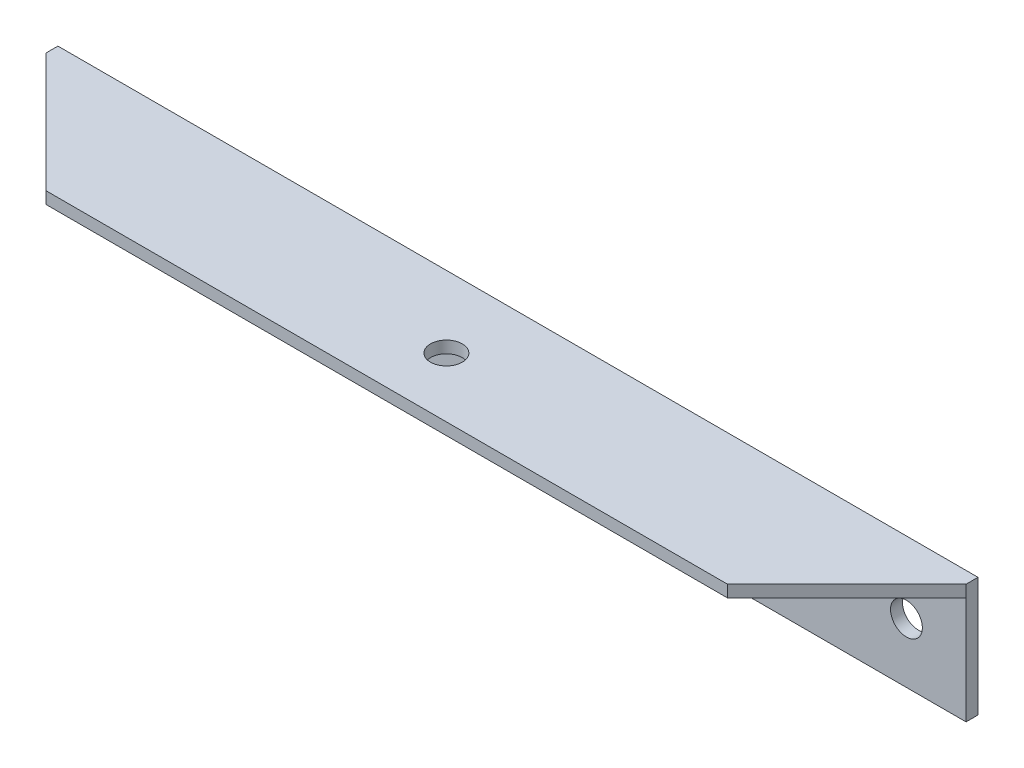
ISO-10303-21;
HEADER;
FILE_DESCRIPTION(('STEP AP214'),'2;1');
FILE_NAME('part.step','',(''),(''),'','','');
FILE_SCHEMA(('AUTOMOTIVE_DESIGN { 1 0 10303 214 1 1 1 1 }'));
ENDSEC;
DATA;
#1=APPLICATION_CONTEXT('core data for automotive mechanical design processes');
#2=APPLICATION_PROTOCOL_DEFINITION('international standard','automotive_design',2000,#1);
#3=PRODUCT_CONTEXT('',#1,'mechanical');
#4=PRODUCT('Part','Part','',(#3));
#5=PRODUCT_RELATED_PRODUCT_CATEGORY('part','',(#4));
#6=PRODUCT_DEFINITION_FORMATION('','',#4);
#7=PRODUCT_DEFINITION_CONTEXT('part definition',#1,'design');
#8=PRODUCT_DEFINITION('design','',#6,#7);
#9=PRODUCT_DEFINITION_SHAPE('','',#8);
#10=(LENGTH_UNIT() NAMED_UNIT(*) SI_UNIT(.MILLI.,.METRE.));
#11=(NAMED_UNIT(*) PLANE_ANGLE_UNIT() SI_UNIT($,.RADIAN.));
#12=(NAMED_UNIT(*) SI_UNIT($,.STERADIAN.) SOLID_ANGLE_UNIT());
#13=UNCERTAINTY_MEASURE_WITH_UNIT(LENGTH_MEASURE(1.E-05),#10,'distance_accuracy_value','');
#14=(GEOMETRIC_REPRESENTATION_CONTEXT(3) GLOBAL_UNCERTAINTY_ASSIGNED_CONTEXT((#13)) GLOBAL_UNIT_ASSIGNED_CONTEXT((#10,
#11,#12)) REPRESENTATION_CONTEXT('',''));
#15=CARTESIAN_POINT('',(0.,0.,0.));
#16=DIRECTION('',(0.,0.,1.));
#17=DIRECTION('',(1.,0.,0.));
#18=AXIS2_PLACEMENT_3D('',#15,#16,#17);
#19=CARTESIAN_POINT('',(-115.7,-30.,3.));
#20=DIRECTION('',(0.,1.,0.));
#21=DIRECTION('',(-1.,0.,0.));
#22=AXIS2_PLACEMENT_3D('',#19,#20,#21);
#23=PLANE('',#22);
#24=DIRECTION('',(1.,0.,0.));
#25=VECTOR('',#24,1.);
#26=CARTESIAN_POINT('',(-115.7,-30.,0.));
#27=LINE('',#26,#25);
#28=CARTESIAN_POINT('',(-115.7,-30.,0.));
#29=VERTEX_POINT('',#28);
#30=CARTESIAN_POINT('',(115.7,-30.,0.));
#31=VERTEX_POINT('',#30);
#32=EDGE_CURVE('E94',#29,#31,#27,.T.);
#33=ORIENTED_EDGE('',*,*,#32,.T.);
#34=DIRECTION('',(0.,0.,-1.));
#35=VECTOR('',#34,1.);
#36=CARTESIAN_POINT('',(115.7,-30.,3.));
#37=LINE('',#36,#35);
#38=CARTESIAN_POINT('',(115.7,-30.,3.));
#39=VERTEX_POINT('',#38);
#40=EDGE_CURVE('E11',#39,#31,#37,.T.);
#41=ORIENTED_EDGE('',*,*,#40,.F.);
#42=DIRECTION('',(1.,0.,0.));
#43=VECTOR('',#42,1.);
#44=CARTESIAN_POINT('',(-115.7,-30.,3.));
#45=LINE('',#44,#43);
#46=CARTESIAN_POINT('',(-115.7,-30.,3.));
#47=VERTEX_POINT('',#46);
#48=EDGE_CURVE('E88',#47,#39,#45,.T.);
#49=ORIENTED_EDGE('',*,*,#48,.F.);
#50=DIRECTION('',(0.,0.,-1.));
#51=VECTOR('',#50,1.);
#52=CARTESIAN_POINT('',(-115.7,-30.,3.));
#53=LINE('',#52,#51);
#54=EDGE_CURVE('E80',#47,#29,#53,.T.);
#55=ORIENTED_EDGE('',*,*,#54,.T.);
#56=EDGE_LOOP('',(#33,#41,#49,#55));
#57=FACE_BOUND('',#56,.T.);
#58=ADVANCED_FACE('F34',(#57),#23,.F.);
#59=CARTESIAN_POINT('',(115.7,0.,3.));
#60=DIRECTION('',(-1.,0.,0.));
#61=DIRECTION('',(0.,0.,1.));
#62=AXIS2_PLACEMENT_3D('',#59,#60,#61);
#63=PLANE('',#62);
#64=DIRECTION('',(0.,1.,0.));
#65=VECTOR('',#64,1.);
#66=CARTESIAN_POINT('',(115.7,0.,0.));
#67=LINE('',#66,#65);
#68=CARTESIAN_POINT('',(115.7,0.,0.));
#69=VERTEX_POINT('',#68);
#70=EDGE_CURVE('E98',#31,#69,#67,.T.);
#71=ORIENTED_EDGE('',*,*,#70,.T.);
#72=DIRECTION('',(0.,0.,-1.));
#73=VECTOR('',#72,1.);
#74=CARTESIAN_POINT('',(115.7,0.,3.));
#75=LINE('',#74,#73);
#76=CARTESIAN_POINT('',(115.7,0.,3.));
#77=VERTEX_POINT('',#76);
#78=EDGE_CURVE('E41',#77,#69,#75,.T.);
#79=ORIENTED_EDGE('',*,*,#78,.F.);
#80=DIRECTION('',(0.,1.,0.));
#81=VECTOR('',#80,1.);
#82=CARTESIAN_POINT('',(115.7,-3.,3.));
#83=LINE('',#82,#81);
#84=CARTESIAN_POINT('',(115.7,-3.,3.));
#85=VERTEX_POINT('',#84);
#86=EDGE_CURVE('E99',#85,#77,#83,.T.);
#87=ORIENTED_EDGE('',*,*,#86,.F.);
#88=DIRECTION('',(0.,1.,0.));
#89=VECTOR('',#88,1.);
#90=CARTESIAN_POINT('',(115.7,0.,3.));
#91=LINE('',#90,#89);
#92=EDGE_CURVE('E168',#39,#85,#91,.T.);
#93=ORIENTED_EDGE('',*,*,#92,.F.);
#94=ORIENTED_EDGE('',*,*,#40,.T.);
#95=EDGE_LOOP('',(#71,#79,#87,#93,#94));
#96=FACE_BOUND('',#95,.T.);
#97=ADVANCED_FACE('F120',(#96),#63,.F.);
#98=CARTESIAN_POINT('',(-115.7,0.,3.));
#99=DIRECTION('',(0.,-1.,0.));
#100=DIRECTION('',(0.,0.,-1.));
#101=AXIS2_PLACEMENT_3D('',#98,#99,#100);
#102=PLANE('',#101);
#103=CARTESIAN_POINT('',(0.,0.,18.));
#104=DIRECTION('',(0.,-1.,0.));
#105=DIRECTION('',(0.,0.,-1.));
#106=AXIS2_PLACEMENT_3D('',#103,#104,#105);
#107=CIRCLE('',#106,4.);
#108=CARTESIAN_POINT('',(0.,0.,14.));
#109=VERTEX_POINT('',#108);
#110=EDGE_CURVE('E199',#109,#109,#107,.T.);
#111=ORIENTED_EDGE('',*,*,#110,.T.);
#112=EDGE_LOOP('',(#111));
#113=FACE_BOUND('',#112,.T.);
#114=DIRECTION('',(-1.,0.,0.));
#115=VECTOR('',#114,1.);
#116=CARTESIAN_POINT('',(-115.7,0.,0.));
#117=LINE('',#116,#115);
#118=CARTESIAN_POINT('',(-115.7,0.,0.));
#119=VERTEX_POINT('',#118);
#120=EDGE_CURVE('E89',#69,#119,#117,.T.);
#121=ORIENTED_EDGE('',*,*,#120,.T.);
#122=DIRECTION('',(0.,0.,-1.));
#123=VECTOR('',#122,1.);
#124=CARTESIAN_POINT('',(-115.7,0.,3.));
#125=LINE('',#124,#123);
#126=CARTESIAN_POINT('',(-115.7,0.,3.));
#127=VERTEX_POINT('',#126);
#128=EDGE_CURVE('E84',#127,#119,#125,.T.);
#129=ORIENTED_EDGE('',*,*,#128,.F.);
#130=DIRECTION('',(0.707106781186546,0.,0.707106781186549));
#131=VECTOR('',#130,1.);
#132=CARTESIAN_POINT('',(-115.7,0.,3.));
#133=LINE('',#132,#131);
#134=CARTESIAN_POINT('',(-85.7000000000001,0.,33.));
#135=VERTEX_POINT('',#134);
#136=EDGE_CURVE('E164',#127,#135,#133,.T.);
#137=ORIENTED_EDGE('',*,*,#136,.T.);
#138=DIRECTION('',(1.,0.,0.));
#139=VECTOR('',#138,1.);
#140=CARTESIAN_POINT('',(-85.7000000000001,0.,33.));
#141=LINE('',#140,#139);
#142=CARTESIAN_POINT('',(85.6999999999997,0.,33.));
#143=VERTEX_POINT('',#142);
#144=EDGE_CURVE('E146',#135,#143,#141,.T.);
#145=ORIENTED_EDGE('',*,*,#144,.T.);
#146=DIRECTION('',(0.707106781186551,0.,-0.707106781186544));
#147=VECTOR('',#146,1.);
#148=CARTESIAN_POINT('',(115.7,0.,3.));
#149=LINE('',#148,#147);
#150=EDGE_CURVE('E117',#143,#77,#149,.T.);
#151=ORIENTED_EDGE('',*,*,#150,.T.);
#152=ORIENTED_EDGE('',*,*,#78,.T.);
#153=EDGE_LOOP('',(#121,#129,#137,#145,#151,#152));
#154=FACE_BOUND('',#153,.T.);
#155=ADVANCED_FACE('F113',(#113,#154),#102,.F.);
#156=CARTESIAN_POINT('',(-115.7,0.,3.));
#157=DIRECTION('',(1.,0.,0.));
#158=DIRECTION('',(0.,0.,-1.));
#159=AXIS2_PLACEMENT_3D('',#156,#157,#158);
#160=PLANE('',#159);
#161=DIRECTION('',(0.,-1.,0.));
#162=VECTOR('',#161,1.);
#163=CARTESIAN_POINT('',(-115.7,0.,0.));
#164=LINE('',#163,#162);
#165=EDGE_CURVE('E77',#119,#29,#164,.T.);
#166=ORIENTED_EDGE('',*,*,#165,.T.);
#167=ORIENTED_EDGE('',*,*,#54,.F.);
#168=DIRECTION('',(0.,-1.,0.));
#169=VECTOR('',#168,1.);
#170=CARTESIAN_POINT('',(-115.7,0.,3.));
#171=LINE('',#170,#169);
#172=CARTESIAN_POINT('',(-115.7,-3.,3.));
#173=VERTEX_POINT('',#172);
#174=EDGE_CURVE('E57',#173,#47,#171,.T.);
#175=ORIENTED_EDGE('',*,*,#174,.F.);
#176=EDGE_CURVE('E95',#127,#173,#171,.T.);
#177=ORIENTED_EDGE('',*,*,#176,.F.);
#178=ORIENTED_EDGE('',*,*,#128,.T.);
#179=EDGE_LOOP('',(#166,#167,#175,#177,#178));
#180=FACE_BOUND('',#179,.T.);
#181=ADVANCED_FACE('F79',(#180),#160,.F.);
#182=CARTESIAN_POINT('',(0.,0.,3.));
#183=DIRECTION('',(0.,0.,-1.));
#184=DIRECTION('',(-1.,0.,0.));
#185=AXIS2_PLACEMENT_3D('',#182,#183,#184);
#186=PLANE('',#185);
#187=CARTESIAN_POINT('',(-100.69999999989,-15.0000000002572,3.));
#188=DIRECTION('',(0.,0.,-1.));
#189=DIRECTION('',(-1.,0.,0.));
#190=AXIS2_PLACEMENT_3D('',#187,#188,#189);
#191=CIRCLE('',#190,4.);
#192=CARTESIAN_POINT('',(-104.69999999989,-15.0000000002572,3.));
#193=VERTEX_POINT('',#192);
#194=EDGE_CURVE('E205',#193,#193,#191,.T.);
#195=ORIENTED_EDGE('',*,*,#194,.T.);
#196=EDGE_LOOP('',(#195));
#197=FACE_BOUND('',#196,.T.);
#198=CARTESIAN_POINT('',(100.700000000335,-15.0000000002572,3.));
#199=DIRECTION('',(0.,0.,-1.));
#200=DIRECTION('',(-1.,0.,0.));
#201=AXIS2_PLACEMENT_3D('',#198,#199,#200);
#202=CIRCLE('',#201,3.99999999999999);
#203=CARTESIAN_POINT('',(96.7000000003347,-15.0000000002572,3.));
#204=VERTEX_POINT('',#203);
#205=EDGE_CURVE('E159',#204,#204,#202,.T.);
#206=ORIENTED_EDGE('',*,*,#205,.T.);
#207=EDGE_LOOP('',(#206));
#208=FACE_BOUND('',#207,.T.);
#209=ORIENTED_EDGE('',*,*,#92,.T.);
#210=DIRECTION('',(-1.,0.,0.));
#211=VECTOR('',#210,1.);
#212=CARTESIAN_POINT('',(-115.7,-3.,3.));
#213=LINE('',#212,#211);
#214=EDGE_CURVE('E149',#85,#173,#213,.T.);
#215=ORIENTED_EDGE('',*,*,#214,.T.);
#216=ORIENTED_EDGE('',*,*,#174,.T.);
#217=ORIENTED_EDGE('',*,*,#48,.T.);
#218=EDGE_LOOP('',(#209,#215,#216,#217));
#219=FACE_BOUND('',#218,.T.);
#220=ADVANCED_FACE('F169',(#197,#208,#219),#186,.F.);
#221=CARTESIAN_POINT('',(0.,0.,0.));
#222=DIRECTION('',(0.,0.,-1.));
#223=DIRECTION('',(-1.,0.,0.));
#224=AXIS2_PLACEMENT_3D('',#221,#222,#223);
#225=PLANE('',#224);
#226=CARTESIAN_POINT('',(-100.69999999989,-15.0000000002572,0.));
#227=DIRECTION('',(0.,0.,-1.));
#228=DIRECTION('',(-1.,0.,0.));
#229=AXIS2_PLACEMENT_3D('',#226,#227,#228);
#230=CIRCLE('',#229,4.);
#231=CARTESIAN_POINT('',(-104.69999999989,-15.0000000002572,0.));
#232=VERTEX_POINT('',#231);
#233=EDGE_CURVE('E201',#232,#232,#230,.T.);
#234=ORIENTED_EDGE('',*,*,#233,.F.);
#235=EDGE_LOOP('',(#234));
#236=FACE_BOUND('',#235,.T.);
#237=CARTESIAN_POINT('',(100.700000000335,-15.0000000002572,0.));
#238=DIRECTION('',(0.,0.,-1.));
#239=DIRECTION('',(-1.,0.,0.));
#240=AXIS2_PLACEMENT_3D('',#237,#238,#239);
#241=CIRCLE('',#240,3.99999999999999);
#242=CARTESIAN_POINT('',(96.7000000003347,-15.0000000002572,0.));
#243=VERTEX_POINT('',#242);
#244=EDGE_CURVE('E210',#243,#243,#241,.T.);
#245=ORIENTED_EDGE('',*,*,#244,.F.);
#246=EDGE_LOOP('',(#245));
#247=FACE_BOUND('',#246,.T.);
#248=ORIENTED_EDGE('',*,*,#32,.F.);
#249=ORIENTED_EDGE('',*,*,#165,.F.);
#250=ORIENTED_EDGE('',*,*,#120,.F.);
#251=ORIENTED_EDGE('',*,*,#70,.F.);
#252=EDGE_LOOP('',(#248,#249,#250,#251));
#253=FACE_BOUND('',#252,.T.);
#254=ADVANCED_FACE('F97',(#236,#247,#253),#225,.T.);
#255=CARTESIAN_POINT('',(-115.7,-3.,3.));
#256=DIRECTION('',(-0.707106781186549,0.,0.707106781186546));
#257=DIRECTION('',(0.707106781186546,0.,0.707106781186549));
#258=AXIS2_PLACEMENT_3D('',#255,#256,#257);
#259=PLANE('',#258);
#260=ORIENTED_EDGE('',*,*,#136,.F.);
#261=ORIENTED_EDGE('',*,*,#176,.T.);
#262=DIRECTION('',(0.707106781186546,0.,0.707106781186549));
#263=VECTOR('',#262,1.);
#264=CARTESIAN_POINT('',(-115.7,-3.,3.));
#265=LINE('',#264,#263);
#266=CARTESIAN_POINT('',(-85.7000000000001,-3.,33.));
#267=VERTEX_POINT('',#266);
#268=EDGE_CURVE('E48',#173,#267,#265,.T.);
#269=ORIENTED_EDGE('',*,*,#268,.T.);
#270=DIRECTION('',(0.,1.,0.));
#271=VECTOR('',#270,1.);
#272=CARTESIAN_POINT('',(-85.7000000000001,-3.,33.));
#273=LINE('',#272,#271);
#274=EDGE_CURVE('E143',#267,#135,#273,.T.);
#275=ORIENTED_EDGE('',*,*,#274,.T.);
#276=EDGE_LOOP('',(#260,#261,#269,#275));
#277=FACE_BOUND('',#276,.T.);
#278=ADVANCED_FACE('F155',(#277),#259,.T.);
#279=CARTESIAN_POINT('',(115.7,-3.,3.));
#280=DIRECTION('',(0.707106781186544,0.,0.707106781186551));
#281=DIRECTION('',(0.707106781186551,0.,-0.707106781186544));
#282=AXIS2_PLACEMENT_3D('',#279,#280,#281);
#283=PLANE('',#282);
#284=ORIENTED_EDGE('',*,*,#150,.F.);
#285=DIRECTION('',(0.,1.,0.));
#286=VECTOR('',#285,1.);
#287=CARTESIAN_POINT('',(85.6999999999997,-3.,33.));
#288=LINE('',#287,#286);
#289=CARTESIAN_POINT('',(85.6999999999997,-3.,33.));
#290=VERTEX_POINT('',#289);
#291=EDGE_CURVE('E103',#290,#143,#288,.T.);
#292=ORIENTED_EDGE('',*,*,#291,.F.);
#293=DIRECTION('',(0.707106781186551,0.,-0.707106781186544));
#294=VECTOR('',#293,1.);
#295=CARTESIAN_POINT('',(115.7,-3.,3.));
#296=LINE('',#295,#294);
#297=EDGE_CURVE('E153',#290,#85,#296,.T.);
#298=ORIENTED_EDGE('',*,*,#297,.T.);
#299=ORIENTED_EDGE('',*,*,#86,.T.);
#300=EDGE_LOOP('',(#284,#292,#298,#299));
#301=FACE_BOUND('',#300,.T.);
#302=ADVANCED_FACE('F232',(#301),#283,.T.);
#303=CARTESIAN_POINT('',(-85.7000000000001,-3.,33.));
#304=DIRECTION('',(0.,0.,1.));
#305=DIRECTION('',(1.,0.,0.));
#306=AXIS2_PLACEMENT_3D('',#303,#304,#305);
#307=PLANE('',#306);
#308=ORIENTED_EDGE('',*,*,#144,.F.);
#309=ORIENTED_EDGE('',*,*,#274,.F.);
#310=DIRECTION('',(1.,0.,0.));
#311=VECTOR('',#310,1.);
#312=CARTESIAN_POINT('',(-85.7000000000001,-3.,33.));
#313=LINE('',#312,#311);
#314=EDGE_CURVE('E145',#267,#290,#313,.T.);
#315=ORIENTED_EDGE('',*,*,#314,.T.);
#316=ORIENTED_EDGE('',*,*,#291,.T.);
#317=EDGE_LOOP('',(#308,#309,#315,#316));
#318=FACE_BOUND('',#317,.T.);
#319=ADVANCED_FACE('F144',(#318),#307,.T.);
#320=CARTESIAN_POINT('',(0.,-3.,0.));
#321=DIRECTION('',(0.,-1.,0.));
#322=DIRECTION('',(0.,0.,-1.));
#323=AXIS2_PLACEMENT_3D('',#320,#321,#322);
#324=PLANE('',#323);
#325=CARTESIAN_POINT('',(0.,-3.,18.));
#326=DIRECTION('',(0.,-1.,0.));
#327=DIRECTION('',(0.,0.,-1.));
#328=AXIS2_PLACEMENT_3D('',#325,#326,#327);
#329=CIRCLE('',#328,4.);
#330=CARTESIAN_POINT('',(0.,-3.,14.));
#331=VERTEX_POINT('',#330);
#332=EDGE_CURVE('E202',#331,#331,#329,.T.);
#333=ORIENTED_EDGE('',*,*,#332,.F.);
#334=EDGE_LOOP('',(#333));
#335=FACE_BOUND('',#334,.T.);
#336=ORIENTED_EDGE('',*,*,#268,.F.);
#337=ORIENTED_EDGE('',*,*,#214,.F.);
#338=ORIENTED_EDGE('',*,*,#297,.F.);
#339=ORIENTED_EDGE('',*,*,#314,.F.);
#340=EDGE_LOOP('',(#336,#337,#338,#339));
#341=FACE_BOUND('',#340,.T.);
#342=ADVANCED_FACE('F152',(#335,#341),#324,.T.);
#343=CARTESIAN_POINT('',(100.700000000335,-15.0000000002572,0.));
#344=DIRECTION('',(0.,0.,-1.));
#345=DIRECTION('',(-1.,0.,0.));
#346=AXIS2_PLACEMENT_3D('',#343,#344,#345);
#347=CYLINDRICAL_SURFACE('',#346,3.99999999999999);
#348=ORIENTED_EDGE('',*,*,#244,.T.);
#349=EDGE_LOOP('',(#348));
#350=FACE_BOUND('',#349,.T.);
#351=ORIENTED_EDGE('',*,*,#205,.F.);
#352=EDGE_LOOP('',(#351));
#353=FACE_BOUND('',#352,.T.);
#354=ADVANCED_FACE('F217',(#350,#353),#347,.F.);
#355=CARTESIAN_POINT('',(-100.69999999989,-15.0000000002572,0.));
#356=DIRECTION('',(0.,0.,-1.));
#357=DIRECTION('',(-1.,0.,0.));
#358=AXIS2_PLACEMENT_3D('',#355,#356,#357);
#359=CYLINDRICAL_SURFACE('',#358,4.);
#360=ORIENTED_EDGE('',*,*,#233,.T.);
#361=EDGE_LOOP('',(#360));
#362=FACE_BOUND('',#361,.T.);
#363=ORIENTED_EDGE('',*,*,#194,.F.);
#364=EDGE_LOOP('',(#363));
#365=FACE_BOUND('',#364,.T.);
#366=ADVANCED_FACE('F219',(#362,#365),#359,.F.);
#367=CARTESIAN_POINT('',(0.,-3.,18.));
#368=DIRECTION('',(0.,-1.,0.));
#369=DIRECTION('',(0.,0.,-1.));
#370=AXIS2_PLACEMENT_3D('',#367,#368,#369);
#371=CYLINDRICAL_SURFACE('',#370,4.);
#372=ORIENTED_EDGE('',*,*,#110,.F.);
#373=EDGE_LOOP('',(#372));
#374=FACE_BOUND('',#373,.T.);
#375=ORIENTED_EDGE('',*,*,#332,.T.);
#376=EDGE_LOOP('',(#375));
#377=FACE_BOUND('',#376,.T.);
#378=ADVANCED_FACE('F225',(#374,#377),#371,.F.);
#379=CLOSED_SHELL('',(#58,#97,#155,#181,#220,#254,#278,#302,#319,#342,#354,#366,#378));
#380=MANIFOLD_SOLID_BREP('B2',#379);
#381=ADVANCED_BREP_SHAPE_REPRESENTATION('',(#18,#380),#14);
#382=SHAPE_DEFINITION_REPRESENTATION(#9,#381);
ENDSEC;
END-ISO-10303-21;
